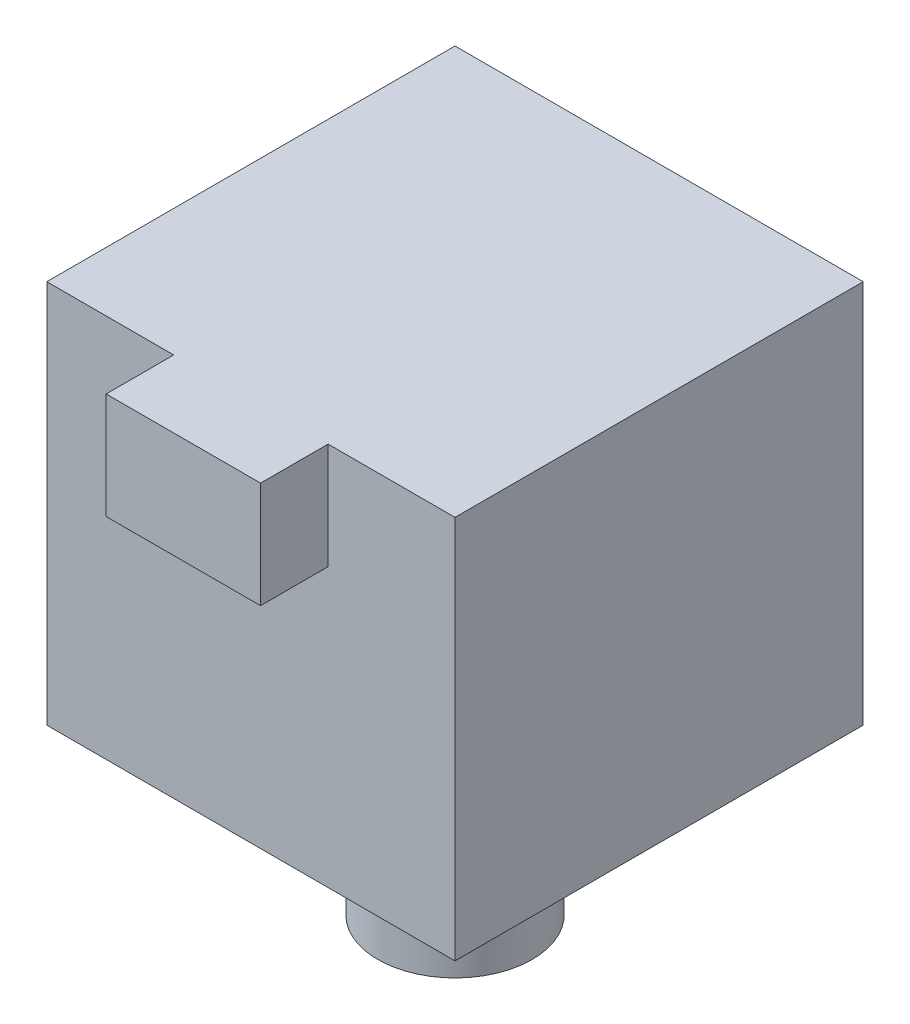
ISO-10303-21;
HEADER;
FILE_DESCRIPTION(('STEP AP214'),'2;1');
FILE_NAME('part.step','',(''),(''),'','','');
FILE_SCHEMA(('AUTOMOTIVE_DESIGN { 1 0 10303 214 1 1 1 1 }'));
ENDSEC;
DATA;
#1=APPLICATION_CONTEXT('core data for automotive mechanical design processes');
#2=APPLICATION_PROTOCOL_DEFINITION('international standard','automotive_design',2000,#1);
#3=PRODUCT_CONTEXT('',#1,'mechanical');
#4=PRODUCT('Part','Part','',(#3));
#5=PRODUCT_RELATED_PRODUCT_CATEGORY('part','',(#4));
#6=PRODUCT_DEFINITION_FORMATION('','',#4);
#7=PRODUCT_DEFINITION_CONTEXT('part definition',#1,'design');
#8=PRODUCT_DEFINITION('design','',#6,#7);
#9=PRODUCT_DEFINITION_SHAPE('','',#8);
#10=(LENGTH_UNIT() NAMED_UNIT(*) SI_UNIT(.MILLI.,.METRE.));
#11=(NAMED_UNIT(*) PLANE_ANGLE_UNIT() SI_UNIT($,.RADIAN.));
#12=(NAMED_UNIT(*) SI_UNIT($,.STERADIAN.) SOLID_ANGLE_UNIT());
#13=UNCERTAINTY_MEASURE_WITH_UNIT(LENGTH_MEASURE(1.E-05),#10,'distance_accuracy_value','');
#14=(GEOMETRIC_REPRESENTATION_CONTEXT(3) GLOBAL_UNCERTAINTY_ASSIGNED_CONTEXT((#13)) GLOBAL_UNIT_ASSIGNED_CONTEXT((#10,
#11,#12)) REPRESENTATION_CONTEXT('',''));
#15=CARTESIAN_POINT('',(0.,0.,0.));
#16=DIRECTION('',(0.,0.,1.));
#17=DIRECTION('',(1.,0.,0.));
#18=AXIS2_PLACEMENT_3D('',#15,#16,#17);
#19=CARTESIAN_POINT('',(0.,-17.032,0.));
#20=DIRECTION('',(0.,1.,0.));
#21=DIRECTION('',(0.,0.,1.));
#22=AXIS2_PLACEMENT_3D('',#19,#20,#21);
#23=CYLINDRICAL_SURFACE('',#22,2.5);
#24=CARTESIAN_POINT('',(0.,-2.032,0.));
#25=DIRECTION('',(0.,-1.,0.));
#26=DIRECTION('',(0.,0.,-1.));
#27=AXIS2_PLACEMENT_3D('',#24,#25,#26);
#28=CIRCLE('',#27,2.5);
#29=CARTESIAN_POINT('',(0.,-2.032,-2.5));
#30=VERTEX_POINT('',#29);
#31=EDGE_CURVE('E163',#30,#30,#28,.T.);
#32=ORIENTED_EDGE('',*,*,#31,.T.);
#33=EDGE_LOOP('',(#32));
#34=FACE_BOUND('',#33,.T.);
#35=CARTESIAN_POINT('',(0.,-6.032,0.));
#36=DIRECTION('',(0.,-1.,0.));
#37=DIRECTION('',(0.,0.,-1.));
#38=AXIS2_PLACEMENT_3D('',#35,#36,#37);
#39=CIRCLE('',#38,2.5);
#40=CARTESIAN_POINT('',(0.,-6.032,-2.5));
#41=VERTEX_POINT('',#40);
#42=EDGE_CURVE('E43',#41,#41,#39,.T.);
#43=ORIENTED_EDGE('',*,*,#42,.F.);
#44=EDGE_LOOP('',(#43));
#45=FACE_BOUND('',#44,.T.);
#46=ADVANCED_FACE('F39',(#34,#45),#23,.T.);
#47=CARTESIAN_POINT('',(-21.15,39.8,21.15));
#48=DIRECTION('',(0.,0.,-1.));
#49=DIRECTION('',(-1.,0.,0.));
#50=AXIS2_PLACEMENT_3D('',#47,#48,#49);
#51=PLANE('',#50);
#52=DIRECTION('',(0.,1.,0.));
#53=VECTOR('',#52,1.);
#54=CARTESIAN_POINT('',(8.,39.8,21.15));
#55=LINE('',#54,#53);
#56=CARTESIAN_POINT('',(8.00000000000003,28.8,21.15));
#57=VERTEX_POINT('',#56);
#58=CARTESIAN_POINT('',(8.00000000000001,39.8,21.15));
#59=VERTEX_POINT('',#58);
#60=EDGE_CURVE('E55',#57,#59,#55,.T.);
#61=ORIENTED_EDGE('',*,*,#60,.F.);
#62=DIRECTION('',(1.,0.,0.));
#63=VECTOR('',#62,1.);
#64=CARTESIAN_POINT('',(-7.99999999999997,28.8,21.15));
#65=LINE('',#64,#63);
#66=CARTESIAN_POINT('',(-7.99999999999997,28.8,21.15));
#67=VERTEX_POINT('',#66);
#68=EDGE_CURVE('E124',#67,#57,#65,.T.);
#69=ORIENTED_EDGE('',*,*,#68,.F.);
#70=DIRECTION('',(0.,-1.,0.));
#71=VECTOR('',#70,1.);
#72=CARTESIAN_POINT('',(-8.,39.8,21.15));
#73=LINE('',#72,#71);
#74=CARTESIAN_POINT('',(-7.99999999999999,39.8,21.15));
#75=VERTEX_POINT('',#74);
#76=EDGE_CURVE('E208',#75,#67,#73,.T.);
#77=ORIENTED_EDGE('',*,*,#76,.F.);
#78=DIRECTION('',(1.,0.,0.));
#79=VECTOR('',#78,1.);
#80=CARTESIAN_POINT('',(-21.15,39.8,21.15));
#81=LINE('',#80,#79);
#82=CARTESIAN_POINT('',(-21.15,39.8,21.15));
#83=VERTEX_POINT('',#82);
#84=EDGE_CURVE('E172',#83,#75,#81,.T.);
#85=ORIENTED_EDGE('',*,*,#84,.F.);
#86=DIRECTION('',(0.,-1.,0.));
#87=VECTOR('',#86,1.);
#88=CARTESIAN_POINT('',(-21.15,39.8,21.15));
#89=LINE('',#88,#87);
#90=CARTESIAN_POINT('',(-21.15,0.,21.15));
#91=VERTEX_POINT('',#90);
#92=EDGE_CURVE('E184',#83,#91,#89,.T.);
#93=ORIENTED_EDGE('',*,*,#92,.T.);
#94=DIRECTION('',(1.,0.,0.));
#95=VECTOR('',#94,1.);
#96=CARTESIAN_POINT('',(-21.15,0.,21.15));
#97=LINE('',#96,#95);
#98=CARTESIAN_POINT('',(21.15,0.,21.15));
#99=VERTEX_POINT('',#98);
#100=EDGE_CURVE('E168',#91,#99,#97,.T.);
#101=ORIENTED_EDGE('',*,*,#100,.T.);
#102=DIRECTION('',(0.,-1.,0.));
#103=VECTOR('',#102,1.);
#104=CARTESIAN_POINT('',(21.15,39.8,21.15));
#105=LINE('',#104,#103);
#106=CARTESIAN_POINT('',(21.15,39.8,21.15));
#107=VERTEX_POINT('',#106);
#108=EDGE_CURVE('E174',#107,#99,#105,.T.);
#109=ORIENTED_EDGE('',*,*,#108,.F.);
#110=EDGE_CURVE('E60',#59,#107,#81,.T.);
#111=ORIENTED_EDGE('',*,*,#110,.F.);
#112=EDGE_LOOP('',(#61,#69,#77,#85,#93,#101,#109,#111));
#113=FACE_BOUND('',#112,.T.);
#114=ADVANCED_FACE('F206',(#113),#51,.F.);
#115=CARTESIAN_POINT('',(21.15,39.8,21.15));
#116=DIRECTION('',(-1.,0.,0.));
#117=DIRECTION('',(0.,0.,1.));
#118=AXIS2_PLACEMENT_3D('',#115,#116,#117);
#119=PLANE('',#118);
#120=DIRECTION('',(0.,0.,-1.));
#121=VECTOR('',#120,1.);
#122=CARTESIAN_POINT('',(21.15,0.,21.15));
#123=LINE('',#122,#121);
#124=CARTESIAN_POINT('',(21.15,0.,-21.15));
#125=VERTEX_POINT('',#124);
#126=EDGE_CURVE('E159',#99,#125,#123,.T.);
#127=ORIENTED_EDGE('',*,*,#126,.T.);
#128=DIRECTION('',(0.,-1.,0.));
#129=VECTOR('',#128,1.);
#130=CARTESIAN_POINT('',(21.15,39.8,-21.15));
#131=LINE('',#130,#129);
#132=CARTESIAN_POINT('',(21.15,39.8,-21.15));
#133=VERTEX_POINT('',#132);
#134=EDGE_CURVE('E164',#133,#125,#131,.T.);
#135=ORIENTED_EDGE('',*,*,#134,.F.);
#136=DIRECTION('',(0.,0.,-1.));
#137=VECTOR('',#136,1.);
#138=CARTESIAN_POINT('',(21.15,39.8,21.15));
#139=LINE('',#138,#137);
#140=EDGE_CURVE('E165',#107,#133,#139,.T.);
#141=ORIENTED_EDGE('',*,*,#140,.F.);
#142=ORIENTED_EDGE('',*,*,#108,.T.);
#143=EDGE_LOOP('',(#127,#135,#141,#142));
#144=FACE_BOUND('',#143,.T.);
#145=ADVANCED_FACE('F41',(#144),#119,.F.);
#146=CARTESIAN_POINT('',(-21.15,39.8,-21.15));
#147=DIRECTION('',(0.,0.,1.));
#148=DIRECTION('',(1.,0.,0.));
#149=AXIS2_PLACEMENT_3D('',#146,#147,#148);
#150=PLANE('',#149);
#151=DIRECTION('',(-1.,0.,0.));
#152=VECTOR('',#151,1.);
#153=CARTESIAN_POINT('',(-21.15,0.,-21.15));
#154=LINE('',#153,#152);
#155=CARTESIAN_POINT('',(-21.15,0.,-21.15));
#156=VERTEX_POINT('',#155);
#157=EDGE_CURVE('E177',#125,#156,#154,.T.);
#158=ORIENTED_EDGE('',*,*,#157,.T.);
#159=DIRECTION('',(0.,-1.,0.));
#160=VECTOR('',#159,1.);
#161=CARTESIAN_POINT('',(-21.15,39.8,-21.15));
#162=LINE('',#161,#160);
#163=CARTESIAN_POINT('',(-21.15,39.8,-21.15));
#164=VERTEX_POINT('',#163);
#165=EDGE_CURVE('E187',#164,#156,#162,.T.);
#166=ORIENTED_EDGE('',*,*,#165,.F.);
#167=DIRECTION('',(-1.,0.,0.));
#168=VECTOR('',#167,1.);
#169=CARTESIAN_POINT('',(-21.15,39.8,-21.15));
#170=LINE('',#169,#168);
#171=EDGE_CURVE('E167',#133,#164,#170,.T.);
#172=ORIENTED_EDGE('',*,*,#171,.F.);
#173=ORIENTED_EDGE('',*,*,#134,.T.);
#174=EDGE_LOOP('',(#158,#166,#172,#173));
#175=FACE_BOUND('',#174,.T.);
#176=ADVANCED_FACE('F192',(#175),#150,.F.);
#177=CARTESIAN_POINT('',(-21.15,39.8,21.15));
#178=DIRECTION('',(1.,0.,0.));
#179=DIRECTION('',(0.,0.,-1.));
#180=AXIS2_PLACEMENT_3D('',#177,#178,#179);
#181=PLANE('',#180);
#182=DIRECTION('',(0.,0.,1.));
#183=VECTOR('',#182,1.);
#184=CARTESIAN_POINT('',(-21.15,0.,21.15));
#185=LINE('',#184,#183);
#186=EDGE_CURVE('E179',#156,#91,#185,.T.);
#187=ORIENTED_EDGE('',*,*,#186,.T.);
#188=ORIENTED_EDGE('',*,*,#92,.F.);
#189=DIRECTION('',(0.,0.,1.));
#190=VECTOR('',#189,1.);
#191=CARTESIAN_POINT('',(-21.15,39.8,21.15));
#192=LINE('',#191,#190);
#193=EDGE_CURVE('E170',#164,#83,#192,.T.);
#194=ORIENTED_EDGE('',*,*,#193,.F.);
#195=ORIENTED_EDGE('',*,*,#165,.T.);
#196=EDGE_LOOP('',(#187,#188,#194,#195));
#197=FACE_BOUND('',#196,.T.);
#198=ADVANCED_FACE('F203',(#197),#181,.F.);
#199=CARTESIAN_POINT('',(0.,39.8,0.));
#200=DIRECTION('',(0.,-1.,0.));
#201=DIRECTION('',(0.,0.,-1.));
#202=AXIS2_PLACEMENT_3D('',#199,#200,#201);
#203=PLANE('',#202);
#204=ORIENTED_EDGE('',*,*,#140,.T.);
#205=ORIENTED_EDGE('',*,*,#171,.T.);
#206=ORIENTED_EDGE('',*,*,#193,.T.);
#207=ORIENTED_EDGE('',*,*,#84,.T.);
#208=DIRECTION('',(0.,0.,-1.));
#209=VECTOR('',#208,1.);
#210=CARTESIAN_POINT('',(-8.,39.8,28.15));
#211=LINE('',#210,#209);
#212=CARTESIAN_POINT('',(-8.,39.8,28.15));
#213=VERTEX_POINT('',#212);
#214=EDGE_CURVE('E111',#213,#75,#211,.T.);
#215=ORIENTED_EDGE('',*,*,#214,.F.);
#216=DIRECTION('',(-1.,0.,0.));
#217=VECTOR('',#216,1.);
#218=CARTESIAN_POINT('',(-8.,39.8,28.15));
#219=LINE('',#218,#217);
#220=CARTESIAN_POINT('',(8.,39.8,28.15));
#221=VERTEX_POINT('',#220);
#222=EDGE_CURVE('E103',#221,#213,#219,.T.);
#223=ORIENTED_EDGE('',*,*,#222,.F.);
#224=DIRECTION('',(0.,0.,-1.));
#225=VECTOR('',#224,1.);
#226=CARTESIAN_POINT('',(8.,39.8,28.15));
#227=LINE('',#226,#225);
#228=EDGE_CURVE('E108',#221,#59,#227,.T.);
#229=ORIENTED_EDGE('',*,*,#228,.T.);
#230=ORIENTED_EDGE('',*,*,#110,.T.);
#231=EDGE_LOOP('',(#204,#205,#206,#207,#215,#223,#229,#230));
#232=FACE_BOUND('',#231,.T.);
#233=ADVANCED_FACE('F106',(#232),#203,.F.);
#234=CARTESIAN_POINT('',(0.,0.,0.));
#235=DIRECTION('',(0.,-1.,0.));
#236=DIRECTION('',(0.,0.,-1.));
#237=AXIS2_PLACEMENT_3D('',#234,#235,#236);
#238=PLANE('',#237);
#239=CARTESIAN_POINT('',(15.5,0.,-15.5));
#240=DIRECTION('',(0.,-1.,0.));
#241=DIRECTION('',(0.,0.,-1.));
#242=AXIS2_PLACEMENT_3D('',#239,#240,#241);
#243=CIRCLE('',#242,1.5);
#244=CARTESIAN_POINT('',(15.5,0.,-17.));
#245=VERTEX_POINT('',#244);
#246=EDGE_CURVE('E130',#245,#245,#243,.T.);
#247=ORIENTED_EDGE('',*,*,#246,.F.);
#248=EDGE_LOOP('',(#247));
#249=FACE_BOUND('',#248,.T.);
#250=CARTESIAN_POINT('',(-15.5,0.,-15.5));
#251=DIRECTION('',(0.,-1.,0.));
#252=DIRECTION('',(0.,0.,-1.));
#253=AXIS2_PLACEMENT_3D('',#250,#251,#252);
#254=CIRCLE('',#253,1.5);
#255=CARTESIAN_POINT('',(-15.5,0.,-17.));
#256=VERTEX_POINT('',#255);
#257=EDGE_CURVE('E143',#256,#256,#254,.T.);
#258=ORIENTED_EDGE('',*,*,#257,.F.);
#259=EDGE_LOOP('',(#258));
#260=FACE_BOUND('',#259,.T.);
#261=CARTESIAN_POINT('',(-15.5,0.,15.5));
#262=DIRECTION('',(0.,-1.,0.));
#263=DIRECTION('',(0.,0.,-1.));
#264=AXIS2_PLACEMENT_3D('',#261,#262,#263);
#265=CIRCLE('',#264,1.5);
#266=CARTESIAN_POINT('',(-15.5,0.,14.));
#267=VERTEX_POINT('',#266);
#268=EDGE_CURVE('E136',#267,#267,#265,.T.);
#269=ORIENTED_EDGE('',*,*,#268,.F.);
#270=EDGE_LOOP('',(#269));
#271=FACE_BOUND('',#270,.T.);
#272=CARTESIAN_POINT('',(15.5,0.,15.5));
#273=DIRECTION('',(0.,-1.,0.));
#274=DIRECTION('',(0.,0.,-1.));
#275=AXIS2_PLACEMENT_3D('',#272,#273,#274);
#276=CIRCLE('',#275,1.5);
#277=CARTESIAN_POINT('',(15.5,0.,14.));
#278=VERTEX_POINT('',#277);
#279=EDGE_CURVE('E139',#278,#278,#276,.T.);
#280=ORIENTED_EDGE('',*,*,#279,.F.);
#281=EDGE_LOOP('',(#280));
#282=FACE_BOUND('',#281,.T.);
#283=CARTESIAN_POINT('',(0.,0.,0.));
#284=DIRECTION('',(0.,-1.,0.));
#285=DIRECTION('',(0.,0.,-1.));
#286=AXIS2_PLACEMENT_3D('',#283,#284,#285);
#287=CIRCLE('',#286,11.);
#288=CARTESIAN_POINT('',(0.,0.,-11.));
#289=VERTEX_POINT('',#288);
#290=EDGE_CURVE('E160',#289,#289,#287,.T.);
#291=ORIENTED_EDGE('',*,*,#290,.F.);
#292=EDGE_LOOP('',(#291));
#293=FACE_BOUND('',#292,.T.);
#294=ORIENTED_EDGE('',*,*,#126,.F.);
#295=ORIENTED_EDGE('',*,*,#100,.F.);
#296=ORIENTED_EDGE('',*,*,#186,.F.);
#297=ORIENTED_EDGE('',*,*,#157,.F.);
#298=EDGE_LOOP('',(#294,#295,#296,#297));
#299=FACE_BOUND('',#298,.T.);
#300=ADVANCED_FACE('F199',(#249,#260,#271,#282,#293,#299),#238,.T.);
#301=CARTESIAN_POINT('',(0.,-2.032,0.));
#302=DIRECTION('',(0.,1.,0.));
#303=DIRECTION('',(0.,0.,1.));
#304=AXIS2_PLACEMENT_3D('',#301,#302,#303);
#305=CYLINDRICAL_SURFACE('',#304,11.);
#306=CARTESIAN_POINT('',(0.,-2.032,0.));
#307=DIRECTION('',(0.,-1.,0.));
#308=DIRECTION('',(0.,0.,-1.));
#309=AXIS2_PLACEMENT_3D('',#306,#307,#308);
#310=CIRCLE('',#309,11.);
#311=CARTESIAN_POINT('',(0.,-2.032,-11.));
#312=VERTEX_POINT('',#311);
#313=EDGE_CURVE('E154',#312,#312,#310,.T.);
#314=ORIENTED_EDGE('',*,*,#313,.F.);
#315=EDGE_LOOP('',(#314));
#316=FACE_BOUND('',#315,.T.);
#317=ORIENTED_EDGE('',*,*,#290,.T.);
#318=EDGE_LOOP('',(#317));
#319=FACE_BOUND('',#318,.T.);
#320=ADVANCED_FACE('F285',(#316,#319),#305,.T.);
#321=CARTESIAN_POINT('',(0.,-2.032,0.));
#322=DIRECTION('',(0.,-1.,0.));
#323=DIRECTION('',(0.,0.,-1.));
#324=AXIS2_PLACEMENT_3D('',#321,#322,#323);
#325=PLANE('',#324);
#326=ORIENTED_EDGE('',*,*,#31,.F.);
#327=EDGE_LOOP('',(#326));
#328=FACE_BOUND('',#327,.T.);
#329=ORIENTED_EDGE('',*,*,#313,.T.);
#330=EDGE_LOOP('',(#329));
#331=FACE_BOUND('',#330,.T.);
#332=ADVANCED_FACE('F282',(#328,#331),#325,.T.);
#333=CARTESIAN_POINT('',(15.5,2.,15.5));
#334=DIRECTION('',(0.,-1.,0.));
#335=DIRECTION('',(0.,0.,-1.));
#336=AXIS2_PLACEMENT_3D('',#333,#334,#335);
#337=CYLINDRICAL_SURFACE('',#336,1.5);
#338=CARTESIAN_POINT('',(15.5,2.,15.5));
#339=DIRECTION('',(0.,-1.,0.));
#340=DIRECTION('',(0.,0.,-1.));
#341=AXIS2_PLACEMENT_3D('',#338,#339,#340);
#342=CIRCLE('',#341,1.5);
#343=CARTESIAN_POINT('',(15.5,2.,14.));
#344=VERTEX_POINT('',#343);
#345=EDGE_CURVE('E151',#344,#344,#342,.T.);
#346=ORIENTED_EDGE('',*,*,#345,.F.);
#347=EDGE_LOOP('',(#346));
#348=FACE_BOUND('',#347,.T.);
#349=ORIENTED_EDGE('',*,*,#279,.T.);
#350=EDGE_LOOP('',(#349));
#351=FACE_BOUND('',#350,.T.);
#352=ADVANCED_FACE('F284',(#348,#351),#337,.F.);
#353=CARTESIAN_POINT('',(15.5,2.,15.5));
#354=DIRECTION('',(0.,-1.,0.));
#355=DIRECTION('',(0.,0.,-1.));
#356=AXIS2_PLACEMENT_3D('',#353,#354,#355);
#357=PLANE('',#356);
#358=ORIENTED_EDGE('',*,*,#345,.T.);
#359=EDGE_LOOP('',(#358));
#360=FACE_BOUND('',#359,.T.);
#361=ADVANCED_FACE('F357',(#360),#357,.T.);
#362=CARTESIAN_POINT('',(-15.5,2.,15.5));
#363=DIRECTION('',(0.,-1.,0.));
#364=DIRECTION('',(0.,0.,-1.));
#365=AXIS2_PLACEMENT_3D('',#362,#363,#364);
#366=CYLINDRICAL_SURFACE('',#365,1.5);
#367=CARTESIAN_POINT('',(-15.5,2.,15.5));
#368=DIRECTION('',(0.,-1.,0.));
#369=DIRECTION('',(0.,0.,-1.));
#370=AXIS2_PLACEMENT_3D('',#367,#368,#369);
#371=CIRCLE('',#370,1.5);
#372=CARTESIAN_POINT('',(-15.5,2.,14.));
#373=VERTEX_POINT('',#372);
#374=EDGE_CURVE('E140',#373,#373,#371,.T.);
#375=ORIENTED_EDGE('',*,*,#374,.F.);
#376=EDGE_LOOP('',(#375));
#377=FACE_BOUND('',#376,.T.);
#378=ORIENTED_EDGE('',*,*,#268,.T.);
#379=EDGE_LOOP('',(#378));
#380=FACE_BOUND('',#379,.T.);
#381=ADVANCED_FACE('F367',(#377,#380),#366,.F.);
#382=CARTESIAN_POINT('',(-15.5,2.,15.5));
#383=DIRECTION('',(0.,-1.,0.));
#384=DIRECTION('',(0.,0.,-1.));
#385=AXIS2_PLACEMENT_3D('',#382,#383,#384);
#386=PLANE('',#385);
#387=ORIENTED_EDGE('',*,*,#374,.T.);
#388=EDGE_LOOP('',(#387));
#389=FACE_BOUND('',#388,.T.);
#390=ADVANCED_FACE('F377',(#389),#386,.T.);
#391=CARTESIAN_POINT('',(-15.5,2.,-15.5));
#392=DIRECTION('',(0.,-1.,0.));
#393=DIRECTION('',(0.,0.,-1.));
#394=AXIS2_PLACEMENT_3D('',#391,#392,#393);
#395=CYLINDRICAL_SURFACE('',#394,1.5);
#396=CARTESIAN_POINT('',(-15.5,2.,-15.5));
#397=DIRECTION('',(0.,-1.,0.));
#398=DIRECTION('',(0.,0.,-1.));
#399=AXIS2_PLACEMENT_3D('',#396,#397,#398);
#400=CIRCLE('',#399,1.5);
#401=CARTESIAN_POINT('',(-15.5,2.,-17.));
#402=VERTEX_POINT('',#401);
#403=EDGE_CURVE('E146',#402,#402,#400,.T.);
#404=ORIENTED_EDGE('',*,*,#403,.F.);
#405=EDGE_LOOP('',(#404));
#406=FACE_BOUND('',#405,.T.);
#407=ORIENTED_EDGE('',*,*,#257,.T.);
#408=EDGE_LOOP('',(#407));
#409=FACE_BOUND('',#408,.T.);
#410=ADVANCED_FACE('F387',(#406,#409),#395,.F.);
#411=CARTESIAN_POINT('',(-15.5,2.,-15.5));
#412=DIRECTION('',(0.,-1.,0.));
#413=DIRECTION('',(0.,0.,-1.));
#414=AXIS2_PLACEMENT_3D('',#411,#412,#413);
#415=PLANE('',#414);
#416=ORIENTED_EDGE('',*,*,#403,.T.);
#417=EDGE_LOOP('',(#416));
#418=FACE_BOUND('',#417,.T.);
#419=ADVANCED_FACE('F397',(#418),#415,.T.);
#420=CARTESIAN_POINT('',(15.5,2.,-15.5));
#421=DIRECTION('',(0.,-1.,0.));
#422=DIRECTION('',(0.,0.,-1.));
#423=AXIS2_PLACEMENT_3D('',#420,#421,#422);
#424=CYLINDRICAL_SURFACE('',#423,1.5);
#425=CARTESIAN_POINT('',(15.5,2.,-15.5));
#426=DIRECTION('',(0.,-1.,0.));
#427=DIRECTION('',(0.,0.,-1.));
#428=AXIS2_PLACEMENT_3D('',#425,#426,#427);
#429=CIRCLE('',#428,1.5);
#430=CARTESIAN_POINT('',(15.5,2.,-17.));
#431=VERTEX_POINT('',#430);
#432=EDGE_CURVE('E127',#431,#431,#429,.T.);
#433=ORIENTED_EDGE('',*,*,#432,.F.);
#434=EDGE_LOOP('',(#433));
#435=FACE_BOUND('',#434,.T.);
#436=ORIENTED_EDGE('',*,*,#246,.T.);
#437=EDGE_LOOP('',(#436));
#438=FACE_BOUND('',#437,.T.);
#439=ADVANCED_FACE('F407',(#435,#438),#424,.F.);
#440=CARTESIAN_POINT('',(15.5,2.,-15.5));
#441=DIRECTION('',(0.,-1.,0.));
#442=DIRECTION('',(0.,0.,-1.));
#443=AXIS2_PLACEMENT_3D('',#440,#441,#442);
#444=PLANE('',#443);
#445=ORIENTED_EDGE('',*,*,#432,.T.);
#446=EDGE_LOOP('',(#445));
#447=FACE_BOUND('',#446,.T.);
#448=ADVANCED_FACE('F417',(#447),#444,.T.);
#449=CARTESIAN_POINT('',(8.,39.8,28.15));
#450=DIRECTION('',(-1.,0.,0.));
#451=DIRECTION('',(0.,-1.,0.));
#452=AXIS2_PLACEMENT_3D('',#449,#450,#451);
#453=PLANE('',#452);
#454=ORIENTED_EDGE('',*,*,#60,.T.);
#455=ORIENTED_EDGE('',*,*,#228,.F.);
#456=DIRECTION('',(0.,1.,0.));
#457=VECTOR('',#456,1.);
#458=CARTESIAN_POINT('',(8.,39.8,28.15));
#459=LINE('',#458,#457);
#460=CARTESIAN_POINT('',(8.00000000000003,28.8,28.15));
#461=VERTEX_POINT('',#460);
#462=EDGE_CURVE('E115',#461,#221,#459,.T.);
#463=ORIENTED_EDGE('',*,*,#462,.F.);
#464=DIRECTION('',(0.,0.,-1.));
#465=VECTOR('',#464,1.);
#466=CARTESIAN_POINT('',(8.00000000000003,28.8,28.15));
#467=LINE('',#466,#465);
#468=EDGE_CURVE('E214',#461,#57,#467,.T.);
#469=ORIENTED_EDGE('',*,*,#468,.T.);
#470=EDGE_LOOP('',(#454,#455,#463,#469));
#471=FACE_BOUND('',#470,.T.);
#472=ADVANCED_FACE('F126',(#471),#453,.F.);
#473=CARTESIAN_POINT('',(-8.,39.8,28.15));
#474=DIRECTION('',(1.,0.,0.));
#475=DIRECTION('',(0.,1.,0.));
#476=AXIS2_PLACEMENT_3D('',#473,#474,#475);
#477=PLANE('',#476);
#478=ORIENTED_EDGE('',*,*,#76,.T.);
#479=DIRECTION('',(0.,0.,-1.));
#480=VECTOR('',#479,1.);
#481=CARTESIAN_POINT('',(-7.99999999999997,28.8,28.15));
#482=LINE('',#481,#480);
#483=CARTESIAN_POINT('',(-7.99999999999997,28.8,28.15));
#484=VERTEX_POINT('',#483);
#485=EDGE_CURVE('E132',#484,#67,#482,.T.);
#486=ORIENTED_EDGE('',*,*,#485,.F.);
#487=DIRECTION('',(0.,-1.,0.));
#488=VECTOR('',#487,1.);
#489=CARTESIAN_POINT('',(-8.,39.8,28.15));
#490=LINE('',#489,#488);
#491=EDGE_CURVE('E114',#213,#484,#490,.T.);
#492=ORIENTED_EDGE('',*,*,#491,.F.);
#493=ORIENTED_EDGE('',*,*,#214,.T.);
#494=EDGE_LOOP('',(#478,#486,#492,#493));
#495=FACE_BOUND('',#494,.T.);
#496=ADVANCED_FACE('F210',(#495),#477,.F.);
#497=CARTESIAN_POINT('',(-7.99999999999997,28.8,28.15));
#498=DIRECTION('',(0.,1.,0.));
#499=DIRECTION('',(-1.,0.,0.));
#500=AXIS2_PLACEMENT_3D('',#497,#498,#499);
#501=PLANE('',#500);
#502=ORIENTED_EDGE('',*,*,#68,.T.);
#503=ORIENTED_EDGE('',*,*,#468,.F.);
#504=DIRECTION('',(1.,0.,0.));
#505=VECTOR('',#504,1.);
#506=CARTESIAN_POINT('',(-7.99999999999997,28.8,28.15));
#507=LINE('',#506,#505);
#508=EDGE_CURVE('E120',#484,#461,#507,.T.);
#509=ORIENTED_EDGE('',*,*,#508,.F.);
#510=ORIENTED_EDGE('',*,*,#485,.T.);
#511=EDGE_LOOP('',(#502,#503,#509,#510));
#512=FACE_BOUND('',#511,.T.);
#513=ADVANCED_FACE('F222',(#512),#501,.F.);
#514=CARTESIAN_POINT('',(0.,0.,28.15));
#515=DIRECTION('',(0.,0.,1.));
#516=DIRECTION('',(1.,0.,0.));
#517=AXIS2_PLACEMENT_3D('',#514,#515,#516);
#518=PLANE('',#517);
#519=ORIENTED_EDGE('',*,*,#462,.T.);
#520=ORIENTED_EDGE('',*,*,#222,.T.);
#521=ORIENTED_EDGE('',*,*,#491,.T.);
#522=ORIENTED_EDGE('',*,*,#508,.T.);
#523=EDGE_LOOP('',(#519,#520,#521,#522));
#524=FACE_BOUND('',#523,.T.);
#525=ADVANCED_FACE('F118',(#524),#518,.T.);
#526=CARTESIAN_POINT('',(0.,-6.032,0.));
#527=DIRECTION('',(0.,-1.,0.));
#528=DIRECTION('',(0.,0.,-1.));
#529=AXIS2_PLACEMENT_3D('',#526,#527,#528);
#530=CYLINDRICAL_SURFACE('',#529,8.);
#531=CARTESIAN_POINT('',(0.,-6.032,0.));
#532=DIRECTION('',(0.,-1.,0.));
#533=DIRECTION('',(0.,0.,-1.));
#534=AXIS2_PLACEMENT_3D('',#531,#532,#533);
#535=CIRCLE('',#534,8.);
#536=CARTESIAN_POINT('',(0.,-6.032,-8.));
#537=VERTEX_POINT('',#536);
#538=EDGE_CURVE('E218',#537,#537,#535,.T.);
#539=ORIENTED_EDGE('',*,*,#538,.T.);
#540=EDGE_LOOP('',(#539));
#541=FACE_BOUND('',#540,.T.);
#542=CARTESIAN_POINT('',(0.,-17.032,0.));
#543=DIRECTION('',(0.,-1.,0.));
#544=DIRECTION('',(0.,0.,-1.));
#545=AXIS2_PLACEMENT_3D('',#542,#543,#544);
#546=CIRCLE('',#545,8.);
#547=CARTESIAN_POINT('',(0.,-17.032,-8.));
#548=VERTEX_POINT('',#547);
#549=EDGE_CURVE('E266',#548,#548,#546,.T.);
#550=ORIENTED_EDGE('',*,*,#549,.F.);
#551=EDGE_LOOP('',(#550));
#552=FACE_BOUND('',#551,.T.);
#553=ADVANCED_FACE('F229',(#541,#552),#530,.T.);
#554=CARTESIAN_POINT('',(0.,-6.032,0.));
#555=DIRECTION('',(0.,-1.,0.));
#556=DIRECTION('',(0.,0.,-1.));
#557=AXIS2_PLACEMENT_3D('',#554,#555,#556);
#558=PLANE('',#557);
#559=ORIENTED_EDGE('',*,*,#42,.T.);
#560=EDGE_LOOP('',(#559));
#561=FACE_BOUND('',#560,.T.);
#562=ORIENTED_EDGE('',*,*,#538,.F.);
#563=EDGE_LOOP('',(#562));
#564=FACE_BOUND('',#563,.T.);
#565=ADVANCED_FACE('F248',(#561,#564),#558,.F.);
#566=CARTESIAN_POINT('',(0.,-17.032,0.));
#567=DIRECTION('',(0.,-1.,0.));
#568=DIRECTION('',(0.,0.,-1.));
#569=AXIS2_PLACEMENT_3D('',#566,#567,#568);
#570=PLANE('',#569);
#571=CARTESIAN_POINT('',(0.,-17.032,0.));
#572=DIRECTION('',(0.,-1.,0.));
#573=DIRECTION('',(0.,0.,-1.));
#574=AXIS2_PLACEMENT_3D('',#571,#572,#573);
#575=CIRCLE('',#574,2.5);
#576=CARTESIAN_POINT('',(0.,-17.032,-2.5));
#577=VERTEX_POINT('',#576);
#578=EDGE_CURVE('E11',#577,#577,#575,.T.);
#579=ORIENTED_EDGE('',*,*,#578,.F.);
#580=EDGE_LOOP('',(#579));
#581=FACE_BOUND('',#580,.T.);
#582=ORIENTED_EDGE('',*,*,#549,.T.);
#583=EDGE_LOOP('',(#582));
#584=FACE_BOUND('',#583,.T.);
#585=ADVANCED_FACE('F244',(#581,#584),#570,.T.);
#586=CARTESIAN_POINT('',(0.,-17.832,0.));
#587=DIRECTION('',(0.,1.,0.));
#588=DIRECTION('',(0.,0.,1.));
#589=AXIS2_PLACEMENT_3D('',#586,#587,#588);
#590=CYLINDRICAL_SURFACE('',#589,2.5);
#591=CARTESIAN_POINT('',(0.,-17.832,0.));
#592=DIRECTION('',(0.,-1.,0.));
#593=DIRECTION('',(0.,0.,-1.));
#594=AXIS2_PLACEMENT_3D('',#591,#592,#593);
#595=CIRCLE('',#594,2.5);
#596=CARTESIAN_POINT('',(0.,-17.832,-2.5));
#597=VERTEX_POINT('',#596);
#598=EDGE_CURVE('E265',#597,#597,#595,.T.);
#599=ORIENTED_EDGE('',*,*,#598,.F.);
#600=EDGE_LOOP('',(#599));
#601=FACE_BOUND('',#600,.T.);
#602=ORIENTED_EDGE('',*,*,#578,.T.);
#603=EDGE_LOOP('',(#602));
#604=FACE_BOUND('',#603,.T.);
#605=ADVANCED_FACE('F247',(#601,#604),#590,.T.);
#606=CARTESIAN_POINT('',(0.,-17.832,0.));
#607=DIRECTION('',(0.,-1.,0.));
#608=DIRECTION('',(0.,0.,-1.));
#609=AXIS2_PLACEMENT_3D('',#606,#607,#608);
#610=PLANE('',#609);
#611=ORIENTED_EDGE('',*,*,#598,.T.);
#612=EDGE_LOOP('',(#611));
#613=FACE_BOUND('',#612,.T.);
#614=ADVANCED_FACE('F257',(#613),#610,.T.);
#615=CLOSED_SHELL('',(#46,#114,#145,#176,#198,#233,#300,#320,#332,#352,#361,#381,#390,#410,#419,
#439,#448,#472,#496,#513,#525,#553,#565,#585,#605,#614));
#616=MANIFOLD_SOLID_BREP('B2',#615);
#617=ADVANCED_BREP_SHAPE_REPRESENTATION('',(#18,#616),#14);
#618=SHAPE_DEFINITION_REPRESENTATION(#9,#617);
ENDSEC;
END-ISO-10303-21;
